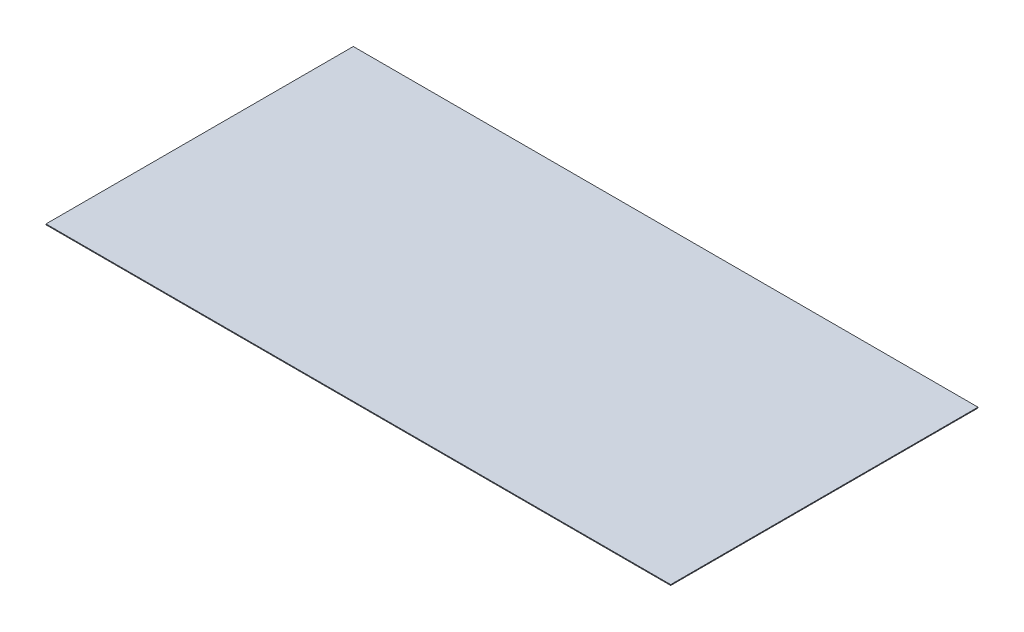
ISO-10303-21;
HEADER;
FILE_DESCRIPTION(('STEP AP214'),'2;1');
FILE_NAME('part.step','',(''),(''),'','','');
FILE_SCHEMA(('AUTOMOTIVE_DESIGN { 1 0 10303 214 1 1 1 1 }'));
ENDSEC;
DATA;
#1=APPLICATION_CONTEXT('core data for automotive mechanical design processes');
#2=APPLICATION_PROTOCOL_DEFINITION('international standard','automotive_design',2000,#1);
#3=PRODUCT_CONTEXT('',#1,'mechanical');
#4=PRODUCT('Part','Part','',(#3));
#5=PRODUCT_RELATED_PRODUCT_CATEGORY('part','',(#4));
#6=PRODUCT_DEFINITION_FORMATION('','',#4);
#7=PRODUCT_DEFINITION_CONTEXT('part definition',#1,'design');
#8=PRODUCT_DEFINITION('design','',#6,#7);
#9=PRODUCT_DEFINITION_SHAPE('','',#8);
#10=(LENGTH_UNIT() NAMED_UNIT(*) SI_UNIT(.MILLI.,.METRE.));
#11=(NAMED_UNIT(*) PLANE_ANGLE_UNIT() SI_UNIT($,.RADIAN.));
#12=(NAMED_UNIT(*) SI_UNIT($,.STERADIAN.) SOLID_ANGLE_UNIT());
#13=UNCERTAINTY_MEASURE_WITH_UNIT(LENGTH_MEASURE(1.E-05),#10,'distance_accuracy_value','');
#14=(GEOMETRIC_REPRESENTATION_CONTEXT(3) GLOBAL_UNCERTAINTY_ASSIGNED_CONTEXT((#13)) GLOBAL_UNIT_ASSIGNED_CONTEXT((#10,
#11,#12)) REPRESENTATION_CONTEXT('',''));
#15=CARTESIAN_POINT('',(0.,0.,0.));
#16=DIRECTION('',(0.,0.,1.));
#17=DIRECTION('',(1.,0.,0.));
#18=AXIS2_PLACEMENT_3D('',#15,#16,#17);
#19=CARTESIAN_POINT('',(-597.537105727262,2.,363.791469194313));
#20=DIRECTION('',(1.,0.,0.));
#21=DIRECTION('',(0.,0.,-1.));
#22=AXIS2_PLACEMENT_3D('',#19,#20,#21);
#23=PLANE('',#22);
#24=DIRECTION('',(0.,0.,1.));
#25=VECTOR('',#24,1.);
#26=CARTESIAN_POINT('',(-597.537105727262,0.,363.791469194313));
#27=LINE('',#26,#25);
#28=CARTESIAN_POINT('',(-597.537105727262,0.,-396.208530805687));
#29=VERTEX_POINT('',#28);
#30=CARTESIAN_POINT('',(-597.537105727262,0.,363.791469194313));
#31=VERTEX_POINT('',#30);
#32=EDGE_CURVE('E107',#29,#31,#27,.T.);
#33=ORIENTED_EDGE('',*,*,#32,.T.);
#34=DIRECTION('',(0.,-1.,0.));
#35=VECTOR('',#34,1.);
#36=CARTESIAN_POINT('',(-597.537105727262,2.,363.791469194313));
#37=LINE('',#36,#35);
#38=CARTESIAN_POINT('',(-597.537105727262,2.,363.791469194313));
#39=VERTEX_POINT('',#38);
#40=EDGE_CURVE('E11',#39,#31,#37,.T.);
#41=ORIENTED_EDGE('',*,*,#40,.F.);
#42=DIRECTION('',(0.,0.,1.));
#43=VECTOR('',#42,1.);
#44=CARTESIAN_POINT('',(-597.537105727262,2.,363.791469194313));
#45=LINE('',#44,#43);
#46=CARTESIAN_POINT('',(-597.537105727262,2.,-396.208530805687));
#47=VERTEX_POINT('',#46);
#48=EDGE_CURVE('E91',#47,#39,#45,.T.);
#49=ORIENTED_EDGE('',*,*,#48,.F.);
#50=DIRECTION('',(0.,-1.,0.));
#51=VECTOR('',#50,1.);
#52=CARTESIAN_POINT('',(-597.537105727262,2.,-396.208530805687));
#53=LINE('',#52,#51);
#54=EDGE_CURVE('E103',#47,#29,#53,.T.);
#55=ORIENTED_EDGE('',*,*,#54,.T.);
#56=EDGE_LOOP('',(#33,#41,#49,#55));
#57=FACE_BOUND('',#56,.T.);
#58=ADVANCED_FACE('F39',(#57),#23,.F.);
#59=CARTESIAN_POINT('',(-597.537105727262,2.,363.791469194313));
#60=DIRECTION('',(0.,0.,-1.));
#61=DIRECTION('',(-1.,0.,0.));
#62=AXIS2_PLACEMENT_3D('',#59,#60,#61);
#63=PLANE('',#62);
#64=DIRECTION('',(1.,0.,0.));
#65=VECTOR('',#64,1.);
#66=CARTESIAN_POINT('',(-597.537105727262,0.,363.791469194313));
#67=LINE('',#66,#65);
#68=CARTESIAN_POINT('',(947.462894272738,0.,363.791469194313));
#69=VERTEX_POINT('',#68);
#70=EDGE_CURVE('E96',#31,#69,#67,.T.);
#71=ORIENTED_EDGE('',*,*,#70,.T.);
#72=DIRECTION('',(0.,-1.,0.));
#73=VECTOR('',#72,1.);
#74=CARTESIAN_POINT('',(947.462894272738,2.,363.791469194313));
#75=LINE('',#74,#73);
#76=CARTESIAN_POINT('',(947.462894272738,2.,363.791469194313));
#77=VERTEX_POINT('',#76);
#78=EDGE_CURVE('E48',#77,#69,#75,.T.);
#79=ORIENTED_EDGE('',*,*,#78,.F.);
#80=DIRECTION('',(1.,0.,0.));
#81=VECTOR('',#80,1.);
#82=CARTESIAN_POINT('',(-597.537105727262,2.,363.791469194313));
#83=LINE('',#82,#81);
#84=EDGE_CURVE('E86',#39,#77,#83,.T.);
#85=ORIENTED_EDGE('',*,*,#84,.F.);
#86=ORIENTED_EDGE('',*,*,#40,.T.);
#87=EDGE_LOOP('',(#71,#79,#85,#86));
#88=FACE_BOUND('',#87,.T.);
#89=ADVANCED_FACE('F95',(#88),#63,.F.);
#90=CARTESIAN_POINT('',(947.462894272738,2.,363.791469194313));
#91=DIRECTION('',(-1.,0.,0.));
#92=DIRECTION('',(0.,0.,1.));
#93=AXIS2_PLACEMENT_3D('',#90,#91,#92);
#94=PLANE('',#93);
#95=DIRECTION('',(0.,0.,-1.));
#96=VECTOR('',#95,1.);
#97=CARTESIAN_POINT('',(947.462894272738,0.,363.791469194313));
#98=LINE('',#97,#96);
#99=CARTESIAN_POINT('',(947.462894272738,0.,-396.208530805687));
#100=VERTEX_POINT('',#99);
#101=EDGE_CURVE('E73',#69,#100,#98,.T.);
#102=ORIENTED_EDGE('',*,*,#101,.T.);
#103=DIRECTION('',(0.,-1.,0.));
#104=VECTOR('',#103,1.);
#105=CARTESIAN_POINT('',(947.462894272738,2.,-396.208530805687));
#106=LINE('',#105,#104);
#107=CARTESIAN_POINT('',(947.462894272738,2.,-396.208530805687));
#108=VERTEX_POINT('',#107);
#109=EDGE_CURVE('E98',#108,#100,#106,.T.);
#110=ORIENTED_EDGE('',*,*,#109,.F.);
#111=DIRECTION('',(0.,0.,-1.));
#112=VECTOR('',#111,1.);
#113=CARTESIAN_POINT('',(947.462894272738,2.,363.791469194313));
#114=LINE('',#113,#112);
#115=EDGE_CURVE('E89',#77,#108,#114,.T.);
#116=ORIENTED_EDGE('',*,*,#115,.F.);
#117=ORIENTED_EDGE('',*,*,#78,.T.);
#118=EDGE_LOOP('',(#102,#110,#116,#117));
#119=FACE_BOUND('',#118,.T.);
#120=ADVANCED_FACE('F99',(#119),#94,.F.);
#121=CARTESIAN_POINT('',(-597.537105727262,2.,-396.208530805687));
#122=DIRECTION('',(0.,0.,1.));
#123=DIRECTION('',(1.,0.,0.));
#124=AXIS2_PLACEMENT_3D('',#121,#122,#123);
#125=PLANE('',#124);
#126=DIRECTION('',(-1.,0.,0.));
#127=VECTOR('',#126,1.);
#128=CARTESIAN_POINT('',(-597.537105727262,0.,-396.208530805687));
#129=LINE('',#128,#127);
#130=EDGE_CURVE('E79',#100,#29,#129,.T.);
#131=ORIENTED_EDGE('',*,*,#130,.T.);
#132=ORIENTED_EDGE('',*,*,#54,.F.);
#133=DIRECTION('',(-1.,0.,0.));
#134=VECTOR('',#133,1.);
#135=CARTESIAN_POINT('',(-597.537105727262,2.,-396.208530805687));
#136=LINE('',#135,#134);
#137=EDGE_CURVE('E56',#108,#47,#136,.T.);
#138=ORIENTED_EDGE('',*,*,#137,.F.);
#139=ORIENTED_EDGE('',*,*,#109,.T.);
#140=EDGE_LOOP('',(#131,#132,#138,#139));
#141=FACE_BOUND('',#140,.T.);
#142=ADVANCED_FACE('F120',(#141),#125,.F.);
#143=CARTESIAN_POINT('',(0.,2.,0.));
#144=DIRECTION('',(0.,-1.,0.));
#145=DIRECTION('',(0.,0.,-1.));
#146=AXIS2_PLACEMENT_3D('',#143,#144,#145);
#147=PLANE('',#146);
#148=ORIENTED_EDGE('',*,*,#48,.T.);
#149=ORIENTED_EDGE('',*,*,#84,.T.);
#150=ORIENTED_EDGE('',*,*,#115,.T.);
#151=ORIENTED_EDGE('',*,*,#137,.T.);
#152=EDGE_LOOP('',(#148,#149,#150,#151));
#153=FACE_BOUND('',#152,.T.);
#154=ADVANCED_FACE('F87',(#153),#147,.F.);
#155=CARTESIAN_POINT('',(0.,0.,0.));
#156=DIRECTION('',(0.,-1.,0.));
#157=DIRECTION('',(0.,0.,-1.));
#158=AXIS2_PLACEMENT_3D('',#155,#156,#157);
#159=PLANE('',#158);
#160=ORIENTED_EDGE('',*,*,#32,.F.);
#161=ORIENTED_EDGE('',*,*,#130,.F.);
#162=ORIENTED_EDGE('',*,*,#101,.F.);
#163=ORIENTED_EDGE('',*,*,#70,.F.);
#164=EDGE_LOOP('',(#160,#161,#162,#163));
#165=FACE_BOUND('',#164,.T.);
#166=ADVANCED_FACE('F123',(#165),#159,.T.);
#167=CLOSED_SHELL('',(#58,#89,#120,#142,#154,#166));
#168=MANIFOLD_SOLID_BREP('B2',#167);
#169=ADVANCED_BREP_SHAPE_REPRESENTATION('',(#18,#168),#14);
#170=SHAPE_DEFINITION_REPRESENTATION(#9,#169);
ENDSEC;
END-ISO-10303-21;
